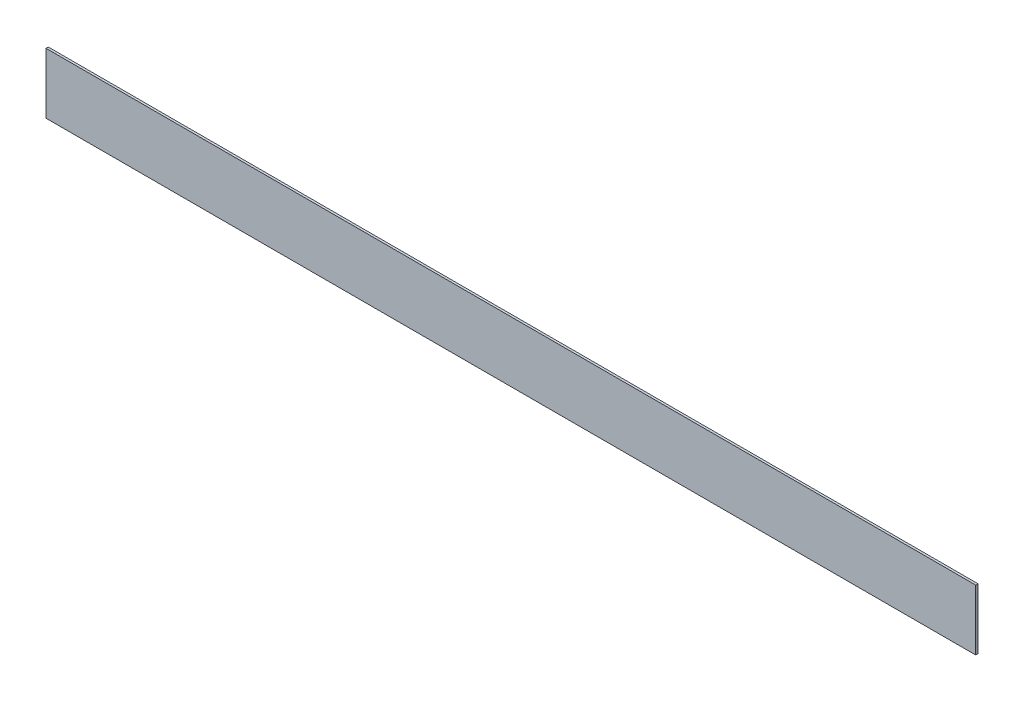
ISO-10303-21;
HEADER;
FILE_DESCRIPTION(('STEP AP214'),'2;1');
FILE_NAME('part.step','',(''),(''),'','','');
FILE_SCHEMA(('AUTOMOTIVE_DESIGN { 1 0 10303 214 1 1 1 1 }'));
ENDSEC;
DATA;
#1=APPLICATION_CONTEXT('core data for automotive mechanical design processes');
#2=APPLICATION_PROTOCOL_DEFINITION('international standard','automotive_design',2000,#1);
#3=PRODUCT_CONTEXT('',#1,'mechanical');
#4=PRODUCT('Part','Part','',(#3));
#5=PRODUCT_RELATED_PRODUCT_CATEGORY('part','',(#4));
#6=PRODUCT_DEFINITION_FORMATION('','',#4);
#7=PRODUCT_DEFINITION_CONTEXT('part definition',#1,'design');
#8=PRODUCT_DEFINITION('design','',#6,#7);
#9=PRODUCT_DEFINITION_SHAPE('','',#8);
#10=(LENGTH_UNIT() NAMED_UNIT(*) SI_UNIT(.MILLI.,.METRE.));
#11=(NAMED_UNIT(*) PLANE_ANGLE_UNIT() SI_UNIT($,.RADIAN.));
#12=(NAMED_UNIT(*) SI_UNIT($,.STERADIAN.) SOLID_ANGLE_UNIT());
#13=UNCERTAINTY_MEASURE_WITH_UNIT(LENGTH_MEASURE(1.E-05),#10,'distance_accuracy_value','');
#14=(GEOMETRIC_REPRESENTATION_CONTEXT(3) GLOBAL_UNCERTAINTY_ASSIGNED_CONTEXT((#13)) GLOBAL_UNIT_ASSIGNED_CONTEXT((#10,
#11,#12)) REPRESENTATION_CONTEXT('',''));
#15=CARTESIAN_POINT('',(0.,0.,0.));
#16=DIRECTION('',(0.,0.,1.));
#17=DIRECTION('',(1.,0.,0.));
#18=AXIS2_PLACEMENT_3D('',#15,#16,#17);
#19=CARTESIAN_POINT('',(0.,0.,5.));
#20=DIRECTION('',(1.,0.,0.));
#21=DIRECTION('',(0.,0.,-1.));
#22=AXIS2_PLACEMENT_3D('',#19,#20,#21);
#23=PLANE('',#22);
#24=DIRECTION('',(0.,-1.,0.));
#25=VECTOR('',#24,1.);
#26=CARTESIAN_POINT('',(0.,0.,0.));
#27=LINE('',#26,#25);
#28=CARTESIAN_POINT('',(0.,0.,0.));
#29=VERTEX_POINT('',#28);
#30=CARTESIAN_POINT('',(0.,-134.,0.));
#31=VERTEX_POINT('',#30);
#32=EDGE_CURVE('E97',#29,#31,#27,.T.);
#33=ORIENTED_EDGE('',*,*,#32,.T.);
#34=DIRECTION('',(0.,0.,-1.));
#35=VECTOR('',#34,1.);
#36=CARTESIAN_POINT('',(0.,-134.,5.));
#37=LINE('',#36,#35);
#38=CARTESIAN_POINT('',(0.,-134.,5.));
#39=VERTEX_POINT('',#38);
#40=EDGE_CURVE('E11',#39,#31,#37,.T.);
#41=ORIENTED_EDGE('',*,*,#40,.F.);
#42=DIRECTION('',(0.,-1.,0.));
#43=VECTOR('',#42,1.);
#44=CARTESIAN_POINT('',(0.,0.,5.));
#45=LINE('',#44,#43);
#46=CARTESIAN_POINT('',(0.,0.,5.));
#47=VERTEX_POINT('',#46);
#48=EDGE_CURVE('E85',#47,#39,#45,.T.);
#49=ORIENTED_EDGE('',*,*,#48,.F.);
#50=DIRECTION('',(0.,0.,-1.));
#51=VECTOR('',#50,1.);
#52=CARTESIAN_POINT('',(0.,0.,5.));
#53=LINE('',#52,#51);
#54=EDGE_CURVE('E93',#47,#29,#53,.T.);
#55=ORIENTED_EDGE('',*,*,#54,.T.);
#56=EDGE_LOOP('',(#33,#41,#49,#55));
#57=FACE_BOUND('',#56,.T.);
#58=ADVANCED_FACE('F34',(#57),#23,.F.);
#59=CARTESIAN_POINT('',(0.,-134.,5.));
#60=DIRECTION('',(0.,1.,0.));
#61=DIRECTION('',(0.,0.,1.));
#62=AXIS2_PLACEMENT_3D('',#59,#60,#61);
#63=PLANE('',#62);
#64=DIRECTION('',(1.,0.,0.));
#65=VECTOR('',#64,1.);
#66=CARTESIAN_POINT('',(0.,-134.,0.));
#67=LINE('',#66,#65);
#68=CARTESIAN_POINT('',(2056.,-134.,0.));
#69=VERTEX_POINT('',#68);
#70=EDGE_CURVE('E89',#31,#69,#67,.T.);
#71=ORIENTED_EDGE('',*,*,#70,.T.);
#72=DIRECTION('',(0.,0.,-1.));
#73=VECTOR('',#72,1.);
#74=CARTESIAN_POINT('',(2056.,-134.,5.));
#75=LINE('',#74,#73);
#76=CARTESIAN_POINT('',(2056.,-134.,5.));
#77=VERTEX_POINT('',#76);
#78=EDGE_CURVE('E42',#77,#69,#75,.T.);
#79=ORIENTED_EDGE('',*,*,#78,.F.);
#80=DIRECTION('',(1.,0.,0.));
#81=VECTOR('',#80,1.);
#82=CARTESIAN_POINT('',(0.,-134.,5.));
#83=LINE('',#82,#81);
#84=EDGE_CURVE('E80',#39,#77,#83,.T.);
#85=ORIENTED_EDGE('',*,*,#84,.F.);
#86=ORIENTED_EDGE('',*,*,#40,.T.);
#87=EDGE_LOOP('',(#71,#79,#85,#86));
#88=FACE_BOUND('',#87,.T.);
#89=ADVANCED_FACE('F88',(#88),#63,.F.);
#90=CARTESIAN_POINT('',(2056.,0.,5.));
#91=DIRECTION('',(-1.,0.,0.));
#92=DIRECTION('',(0.,0.,1.));
#93=AXIS2_PLACEMENT_3D('',#90,#91,#92);
#94=PLANE('',#93);
#95=DIRECTION('',(0.,1.,0.));
#96=VECTOR('',#95,1.);
#97=CARTESIAN_POINT('',(2056.,0.,0.));
#98=LINE('',#97,#96);
#99=CARTESIAN_POINT('',(2056.,0.,0.));
#100=VERTEX_POINT('',#99);
#101=EDGE_CURVE('E67',#69,#100,#98,.T.);
#102=ORIENTED_EDGE('',*,*,#101,.T.);
#103=DIRECTION('',(0.,0.,-1.));
#104=VECTOR('',#103,1.);
#105=CARTESIAN_POINT('',(2056.,0.,5.));
#106=LINE('',#105,#104);
#107=CARTESIAN_POINT('',(2056.,0.,5.));
#108=VERTEX_POINT('',#107);
#109=EDGE_CURVE('E90',#108,#100,#106,.T.);
#110=ORIENTED_EDGE('',*,*,#109,.F.);
#111=DIRECTION('',(0.,1.,0.));
#112=VECTOR('',#111,1.);
#113=CARTESIAN_POINT('',(2056.,0.,5.));
#114=LINE('',#113,#112);
#115=EDGE_CURVE('E83',#77,#108,#114,.T.);
#116=ORIENTED_EDGE('',*,*,#115,.F.);
#117=ORIENTED_EDGE('',*,*,#78,.T.);
#118=EDGE_LOOP('',(#102,#110,#116,#117));
#119=FACE_BOUND('',#118,.T.);
#120=ADVANCED_FACE('F91',(#119),#94,.F.);
#121=CARTESIAN_POINT('',(0.,0.,5.));
#122=DIRECTION('',(0.,-1.,0.));
#123=DIRECTION('',(0.,0.,-1.));
#124=AXIS2_PLACEMENT_3D('',#121,#122,#123);
#125=PLANE('',#124);
#126=DIRECTION('',(-1.,0.,0.));
#127=VECTOR('',#126,1.);
#128=CARTESIAN_POINT('',(0.,0.,0.));
#129=LINE('',#128,#127);
#130=EDGE_CURVE('E73',#100,#29,#129,.T.);
#131=ORIENTED_EDGE('',*,*,#130,.T.);
#132=ORIENTED_EDGE('',*,*,#54,.F.);
#133=DIRECTION('',(-1.,0.,0.));
#134=VECTOR('',#133,1.);
#135=CARTESIAN_POINT('',(0.,0.,5.));
#136=LINE('',#135,#134);
#137=EDGE_CURVE('E50',#108,#47,#136,.T.);
#138=ORIENTED_EDGE('',*,*,#137,.F.);
#139=ORIENTED_EDGE('',*,*,#109,.T.);
#140=EDGE_LOOP('',(#131,#132,#138,#139));
#141=FACE_BOUND('',#140,.T.);
#142=ADVANCED_FACE('F104',(#141),#125,.F.);
#143=CARTESIAN_POINT('',(0.,0.,5.));
#144=DIRECTION('',(0.,0.,1.));
#145=DIRECTION('',(1.,0.,0.));
#146=AXIS2_PLACEMENT_3D('',#143,#144,#145);
#147=PLANE('',#146);
#148=ORIENTED_EDGE('',*,*,#48,.T.);
#149=ORIENTED_EDGE('',*,*,#84,.T.);
#150=ORIENTED_EDGE('',*,*,#115,.T.);
#151=ORIENTED_EDGE('',*,*,#137,.T.);
#152=EDGE_LOOP('',(#148,#149,#150,#151));
#153=FACE_BOUND('',#152,.T.);
#154=ADVANCED_FACE('F81',(#153),#147,.T.);
#155=CARTESIAN_POINT('',(0.,0.,0.));
#156=DIRECTION('',(0.,0.,1.));
#157=DIRECTION('',(1.,0.,0.));
#158=AXIS2_PLACEMENT_3D('',#155,#156,#157);
#159=PLANE('',#158);
#160=ORIENTED_EDGE('',*,*,#32,.F.);
#161=ORIENTED_EDGE('',*,*,#130,.F.);
#162=ORIENTED_EDGE('',*,*,#101,.F.);
#163=ORIENTED_EDGE('',*,*,#70,.F.);
#164=EDGE_LOOP('',(#160,#161,#162,#163));
#165=FACE_BOUND('',#164,.T.);
#166=ADVANCED_FACE('F107',(#165),#159,.F.);
#167=CLOSED_SHELL('',(#58,#89,#120,#142,#154,#166));
#168=MANIFOLD_SOLID_BREP('B2',#167);
#169=ADVANCED_BREP_SHAPE_REPRESENTATION('',(#18,#168),#14);
#170=SHAPE_DEFINITION_REPRESENTATION(#9,#169);
ENDSEC;
END-ISO-10303-21;
